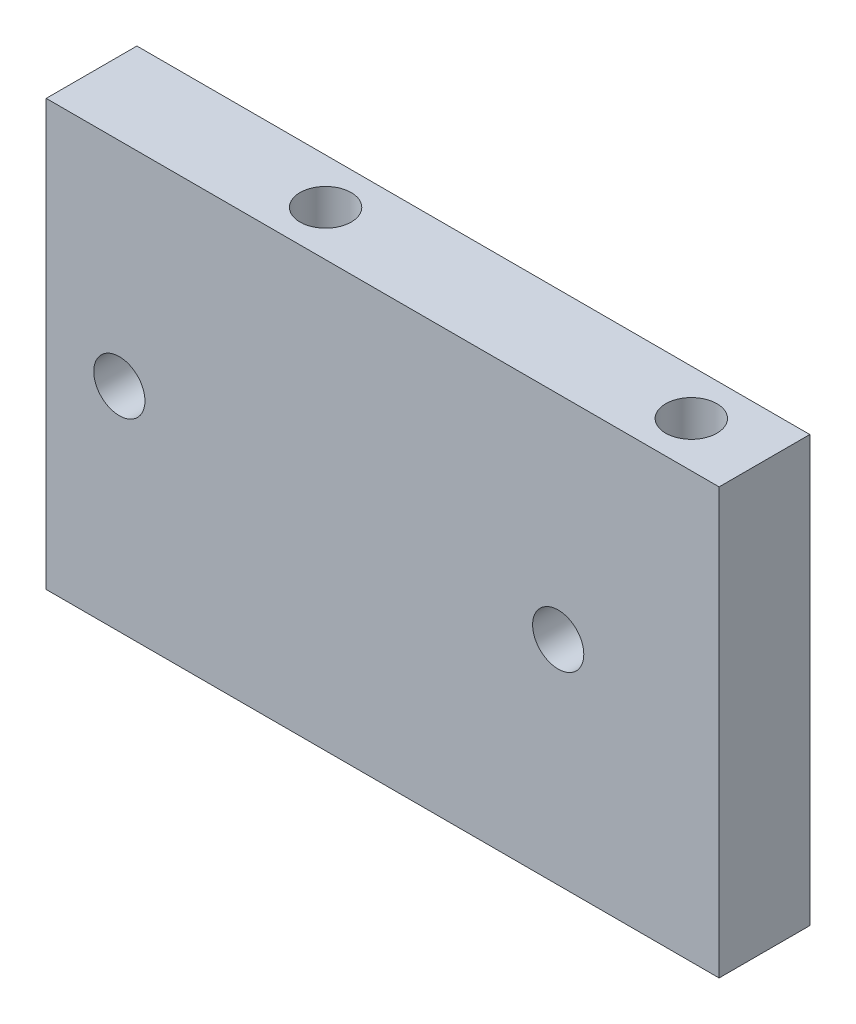
ISO-10303-21;
HEADER;
FILE_DESCRIPTION(('STEP AP214'),'2;1');
FILE_NAME('part.step','',(''),(''),'','','');
FILE_SCHEMA(('AUTOMOTIVE_DESIGN { 1 0 10303 214 1 1 1 1 }'));
ENDSEC;
DATA;
#1=APPLICATION_CONTEXT('core data for automotive mechanical design processes');
#2=APPLICATION_PROTOCOL_DEFINITION('international standard','automotive_design',2000,#1);
#3=PRODUCT_CONTEXT('',#1,'mechanical');
#4=PRODUCT('Part','Part','',(#3));
#5=PRODUCT_RELATED_PRODUCT_CATEGORY('part','',(#4));
#6=PRODUCT_DEFINITION_FORMATION('','',#4);
#7=PRODUCT_DEFINITION_CONTEXT('part definition',#1,'design');
#8=PRODUCT_DEFINITION('design','',#6,#7);
#9=PRODUCT_DEFINITION_SHAPE('','',#8);
#10=(LENGTH_UNIT() NAMED_UNIT(*) SI_UNIT(.MILLI.,.METRE.));
#11=(NAMED_UNIT(*) PLANE_ANGLE_UNIT() SI_UNIT($,.RADIAN.));
#12=(NAMED_UNIT(*) SI_UNIT($,.STERADIAN.) SOLID_ANGLE_UNIT());
#13=UNCERTAINTY_MEASURE_WITH_UNIT(LENGTH_MEASURE(1.E-05),#10,'distance_accuracy_value','');
#14=(GEOMETRIC_REPRESENTATION_CONTEXT(3) GLOBAL_UNCERTAINTY_ASSIGNED_CONTEXT((#13)) GLOBAL_UNIT_ASSIGNED_CONTEXT((#10,
#11,#12)) REPRESENTATION_CONTEXT('',''));
#15=CARTESIAN_POINT('',(0.,0.,0.));
#16=DIRECTION('',(0.,0.,1.));
#17=DIRECTION('',(1.,0.,0.));
#18=AXIS2_PLACEMENT_3D('',#15,#16,#17);
#19=CARTESIAN_POINT('',(23.,14.5375,6.2));
#20=DIRECTION('',(-1.,0.,0.));
#21=DIRECTION('',(0.,0.,1.));
#22=AXIS2_PLACEMENT_3D('',#19,#20,#21);
#23=PLANE('',#22);
#24=DIRECTION('',(0.,1.,0.));
#25=VECTOR('',#24,1.);
#26=CARTESIAN_POINT('',(23.,14.5375,0.));
#27=LINE('',#26,#25);
#28=CARTESIAN_POINT('',(23.,-14.5375,0.));
#29=VERTEX_POINT('',#28);
#30=CARTESIAN_POINT('',(23.,14.5375,0.));
#31=VERTEX_POINT('',#30);
#32=EDGE_CURVE('E102',#29,#31,#27,.T.);
#33=ORIENTED_EDGE('',*,*,#32,.T.);
#34=DIRECTION('',(0.,0.,-1.));
#35=VECTOR('',#34,1.);
#36=CARTESIAN_POINT('',(23.,14.5375,6.2));
#37=LINE('',#36,#35);
#38=CARTESIAN_POINT('',(23.,14.5375,6.2));
#39=VERTEX_POINT('',#38);
#40=EDGE_CURVE('E12',#39,#31,#37,.T.);
#41=ORIENTED_EDGE('',*,*,#40,.F.);
#42=DIRECTION('',(0.,1.,0.));
#43=VECTOR('',#42,1.);
#44=CARTESIAN_POINT('',(23.,14.5375,6.2));
#45=LINE('',#44,#43);
#46=CARTESIAN_POINT('',(23.,-14.5375,6.2));
#47=VERTEX_POINT('',#46);
#48=EDGE_CURVE('E90',#47,#39,#45,.T.);
#49=ORIENTED_EDGE('',*,*,#48,.F.);
#50=DIRECTION('',(0.,0.,-1.));
#51=VECTOR('',#50,1.);
#52=CARTESIAN_POINT('',(23.,-14.5375,6.2));
#53=LINE('',#52,#51);
#54=EDGE_CURVE('E98',#47,#29,#53,.T.);
#55=ORIENTED_EDGE('',*,*,#54,.T.);
#56=EDGE_LOOP('',(#33,#41,#49,#55));
#57=FACE_BOUND('',#56,.T.);
#58=ADVANCED_FACE('F39',(#57),#23,.F.);
#59=CARTESIAN_POINT('',(-23.,14.5375,6.2));
#60=DIRECTION('',(0.,-1.,0.));
#61=DIRECTION('',(0.,0.,-1.));
#62=AXIS2_PLACEMENT_3D('',#59,#60,#61);
#63=PLANE('',#62);
#64=CARTESIAN_POINT('',(18.,14.5375,3.1));
#65=DIRECTION('',(0.,1.,0.));
#66=DIRECTION('',(0.,0.,1.));
#67=AXIS2_PLACEMENT_3D('',#64,#65,#66);
#68=CIRCLE('',#67,1.75);
#69=CARTESIAN_POINT('',(18.,14.5375,4.85));
#70=VERTEX_POINT('',#69);
#71=EDGE_CURVE('E155',#70,#70,#68,.T.);
#72=ORIENTED_EDGE('',*,*,#71,.F.);
#73=EDGE_LOOP('',(#72));
#74=FACE_BOUND('',#73,.T.);
#75=CARTESIAN_POINT('',(-7.,14.5375,3.1));
#76=DIRECTION('',(0.,1.,0.));
#77=DIRECTION('',(0.,0.,1.));
#78=AXIS2_PLACEMENT_3D('',#75,#76,#77);
#79=CIRCLE('',#78,1.75);
#80=CARTESIAN_POINT('',(-7.,14.5375,4.85));
#81=VERTEX_POINT('',#80);
#82=EDGE_CURVE('E149',#81,#81,#79,.T.);
#83=ORIENTED_EDGE('',*,*,#82,.F.);
#84=EDGE_LOOP('',(#83));
#85=FACE_BOUND('',#84,.T.);
#86=DIRECTION('',(-1.,0.,0.));
#87=VECTOR('',#86,1.);
#88=CARTESIAN_POINT('',(-23.,14.5375,0.));
#89=LINE('',#88,#87);
#90=CARTESIAN_POINT('',(-23.,14.5375,0.));
#91=VERTEX_POINT('',#90);
#92=EDGE_CURVE('E94',#31,#91,#89,.T.);
#93=ORIENTED_EDGE('',*,*,#92,.T.);
#94=DIRECTION('',(0.,0.,-1.));
#95=VECTOR('',#94,1.);
#96=CARTESIAN_POINT('',(-23.,14.5375,6.2));
#97=LINE('',#96,#95);
#98=CARTESIAN_POINT('',(-23.,14.5375,6.2));
#99=VERTEX_POINT('',#98);
#100=EDGE_CURVE('E47',#99,#91,#97,.T.);
#101=ORIENTED_EDGE('',*,*,#100,.F.);
#102=DIRECTION('',(-1.,0.,0.));
#103=VECTOR('',#102,1.);
#104=CARTESIAN_POINT('',(-23.,14.5375,6.2));
#105=LINE('',#104,#103);
#106=EDGE_CURVE('E85',#39,#99,#105,.T.);
#107=ORIENTED_EDGE('',*,*,#106,.F.);
#108=ORIENTED_EDGE('',*,*,#40,.T.);
#109=EDGE_LOOP('',(#93,#101,#107,#108));
#110=FACE_BOUND('',#109,.T.);
#111=ADVANCED_FACE('F93',(#74,#85,#110),#63,.F.);
#112=CARTESIAN_POINT('',(-23.,14.5375,6.2));
#113=DIRECTION('',(1.,0.,0.));
#114=DIRECTION('',(0.,0.,-1.));
#115=AXIS2_PLACEMENT_3D('',#112,#113,#114);
#116=PLANE('',#115);
#117=DIRECTION('',(0.,-1.,0.));
#118=VECTOR('',#117,1.);
#119=CARTESIAN_POINT('',(-23.,14.5375,0.));
#120=LINE('',#119,#118);
#121=CARTESIAN_POINT('',(-23.,-14.5375,0.));
#122=VERTEX_POINT('',#121);
#123=EDGE_CURVE('E72',#91,#122,#120,.T.);
#124=ORIENTED_EDGE('',*,*,#123,.T.);
#125=DIRECTION('',(0.,0.,-1.));
#126=VECTOR('',#125,1.);
#127=CARTESIAN_POINT('',(-23.,-14.5375,6.2));
#128=LINE('',#127,#126);
#129=CARTESIAN_POINT('',(-23.,-14.5375,6.2));
#130=VERTEX_POINT('',#129);
#131=EDGE_CURVE('E95',#130,#122,#128,.T.);
#132=ORIENTED_EDGE('',*,*,#131,.F.);
#133=DIRECTION('',(0.,-1.,0.));
#134=VECTOR('',#133,1.);
#135=CARTESIAN_POINT('',(-23.,14.5375,6.2));
#136=LINE('',#135,#134);
#137=EDGE_CURVE('E88',#99,#130,#136,.T.);
#138=ORIENTED_EDGE('',*,*,#137,.F.);
#139=ORIENTED_EDGE('',*,*,#100,.T.);
#140=EDGE_LOOP('',(#124,#132,#138,#139));
#141=FACE_BOUND('',#140,.T.);
#142=ADVANCED_FACE('F96',(#141),#116,.F.);
#143=CARTESIAN_POINT('',(-23.,-14.5375,6.2));
#144=DIRECTION('',(0.,1.,0.));
#145=DIRECTION('',(0.,0.,1.));
#146=AXIS2_PLACEMENT_3D('',#143,#144,#145);
#147=PLANE('',#146);
#148=CARTESIAN_POINT('',(-7.,-14.5375,3.1));
#149=DIRECTION('',(0.,-1.,0.));
#150=DIRECTION('',(0.,0.,-1.));
#151=AXIS2_PLACEMENT_3D('',#148,#149,#150);
#152=CIRCLE('',#151,1.75);
#153=CARTESIAN_POINT('',(-7.,-14.5375,1.35));
#154=VERTEX_POINT('',#153);
#155=EDGE_CURVE('E144',#154,#154,#152,.T.);
#156=ORIENTED_EDGE('',*,*,#155,.F.);
#157=EDGE_LOOP('',(#156));
#158=FACE_BOUND('',#157,.T.);
#159=CARTESIAN_POINT('',(18.,-14.5375,3.1));
#160=DIRECTION('',(0.,-1.,0.));
#161=DIRECTION('',(0.,0.,-1.));
#162=AXIS2_PLACEMENT_3D('',#159,#160,#161);
#163=CIRCLE('',#162,1.75);
#164=CARTESIAN_POINT('',(18.,-14.5375,1.35));
#165=VERTEX_POINT('',#164);
#166=EDGE_CURVE('E137',#165,#165,#163,.T.);
#167=ORIENTED_EDGE('',*,*,#166,.F.);
#168=EDGE_LOOP('',(#167));
#169=FACE_BOUND('',#168,.T.);
#170=DIRECTION('',(1.,0.,0.));
#171=VECTOR('',#170,1.);
#172=CARTESIAN_POINT('',(-23.,-14.5375,0.));
#173=LINE('',#172,#171);
#174=EDGE_CURVE('E78',#122,#29,#173,.T.);
#175=ORIENTED_EDGE('',*,*,#174,.T.);
#176=ORIENTED_EDGE('',*,*,#54,.F.);
#177=DIRECTION('',(1.,0.,0.));
#178=VECTOR('',#177,1.);
#179=CARTESIAN_POINT('',(-23.,-14.5375,6.2));
#180=LINE('',#179,#178);
#181=EDGE_CURVE('E55',#130,#47,#180,.T.);
#182=ORIENTED_EDGE('',*,*,#181,.F.);
#183=ORIENTED_EDGE('',*,*,#131,.T.);
#184=EDGE_LOOP('',(#175,#176,#182,#183));
#185=FACE_BOUND('',#184,.T.);
#186=ADVANCED_FACE('F118',(#158,#169,#185),#147,.F.);
#187=CARTESIAN_POINT('',(0.,0.,6.2));
#188=DIRECTION('',(0.,0.,1.));
#189=DIRECTION('',(1.,0.,0.));
#190=AXIS2_PLACEMENT_3D('',#187,#188,#189);
#191=PLANE('',#190);
#192=CARTESIAN_POINT('',(-18.,0.,6.2));
#193=DIRECTION('',(0.,0.,1.));
#194=DIRECTION('',(1.,0.,0.));
#195=AXIS2_PLACEMENT_3D('',#192,#193,#194);
#196=CIRCLE('',#195,1.75);
#197=CARTESIAN_POINT('',(-16.25,0.,6.2));
#198=VERTEX_POINT('',#197);
#199=EDGE_CURVE('E105',#198,#198,#196,.T.);
#200=ORIENTED_EDGE('',*,*,#199,.F.);
#201=EDGE_LOOP('',(#200));
#202=FACE_BOUND('',#201,.T.);
#203=CARTESIAN_POINT('',(12.,0.,6.2));
#204=DIRECTION('',(0.,0.,1.));
#205=DIRECTION('',(1.,0.,0.));
#206=AXIS2_PLACEMENT_3D('',#203,#204,#205);
#207=CIRCLE('',#206,1.75);
#208=CARTESIAN_POINT('',(13.75,0.,6.2));
#209=VERTEX_POINT('',#208);
#210=EDGE_CURVE('E124',#209,#209,#207,.T.);
#211=ORIENTED_EDGE('',*,*,#210,.F.);
#212=EDGE_LOOP('',(#211));
#213=FACE_BOUND('',#212,.T.);
#214=ORIENTED_EDGE('',*,*,#48,.T.);
#215=ORIENTED_EDGE('',*,*,#106,.T.);
#216=ORIENTED_EDGE('',*,*,#137,.T.);
#217=ORIENTED_EDGE('',*,*,#181,.T.);
#218=EDGE_LOOP('',(#214,#215,#216,#217));
#219=FACE_BOUND('',#218,.T.);
#220=ADVANCED_FACE('F86',(#202,#213,#219),#191,.T.);
#221=CARTESIAN_POINT('',(0.,0.,0.));
#222=DIRECTION('',(0.,0.,1.));
#223=DIRECTION('',(1.,0.,0.));
#224=AXIS2_PLACEMENT_3D('',#221,#222,#223);
#225=PLANE('',#224);
#226=CARTESIAN_POINT('',(-18.,0.,0.));
#227=DIRECTION('',(0.,0.,1.));
#228=DIRECTION('',(1.,0.,0.));
#229=AXIS2_PLACEMENT_3D('',#226,#227,#228);
#230=CIRCLE('',#229,1.75);
#231=CARTESIAN_POINT('',(-16.25,0.,0.));
#232=VERTEX_POINT('',#231);
#233=EDGE_CURVE('E126',#232,#232,#230,.T.);
#234=ORIENTED_EDGE('',*,*,#233,.T.);
#235=EDGE_LOOP('',(#234));
#236=FACE_BOUND('',#235,.T.);
#237=CARTESIAN_POINT('',(12.,0.,0.));
#238=DIRECTION('',(0.,0.,1.));
#239=DIRECTION('',(1.,0.,0.));
#240=AXIS2_PLACEMENT_3D('',#237,#238,#239);
#241=CIRCLE('',#240,1.75);
#242=CARTESIAN_POINT('',(13.75,0.,0.));
#243=VERTEX_POINT('',#242);
#244=EDGE_CURVE('E127',#243,#243,#241,.T.);
#245=ORIENTED_EDGE('',*,*,#244,.T.);
#246=EDGE_LOOP('',(#245));
#247=FACE_BOUND('',#246,.T.);
#248=ORIENTED_EDGE('',*,*,#32,.F.);
#249=ORIENTED_EDGE('',*,*,#174,.F.);
#250=ORIENTED_EDGE('',*,*,#123,.F.);
#251=ORIENTED_EDGE('',*,*,#92,.F.);
#252=EDGE_LOOP('',(#248,#249,#250,#251));
#253=FACE_BOUND('',#252,.T.);
#254=ADVANCED_FACE('F121',(#236,#247,#253),#225,.F.);
#255=CARTESIAN_POINT('',(12.,0.,11.1497474683058));
#256=DIRECTION('',(0.,0.,-1.));
#257=DIRECTION('',(-1.,0.,0.));
#258=AXIS2_PLACEMENT_3D('',#255,#256,#257);
#259=CYLINDRICAL_SURFACE('',#258,1.75);
#260=ORIENTED_EDGE('',*,*,#244,.F.);
#261=EDGE_LOOP('',(#260));
#262=FACE_BOUND('',#261,.T.);
#263=ORIENTED_EDGE('',*,*,#210,.T.);
#264=EDGE_LOOP('',(#263));
#265=FACE_BOUND('',#264,.T.);
#266=ADVANCED_FACE('F225',(#262,#265),#259,.F.);
#267=CARTESIAN_POINT('',(-18.,0.,11.1497474683058));
#268=DIRECTION('',(0.,0.,-1.));
#269=DIRECTION('',(-1.,0.,0.));
#270=AXIS2_PLACEMENT_3D('',#267,#268,#269);
#271=CYLINDRICAL_SURFACE('',#270,1.75);
#272=ORIENTED_EDGE('',*,*,#233,.F.);
#273=EDGE_LOOP('',(#272));
#274=FACE_BOUND('',#273,.T.);
#275=ORIENTED_EDGE('',*,*,#199,.T.);
#276=EDGE_LOOP('',(#275));
#277=FACE_BOUND('',#276,.T.);
#278=ADVANCED_FACE('F233',(#274,#277),#271,.F.);
#279=CARTESIAN_POINT('',(18.,-6.5375,3.1));
#280=DIRECTION('',(0.,-1.,0.));
#281=DIRECTION('',(0.,0.,-1.));
#282=AXIS2_PLACEMENT_3D('',#279,#280,#281);
#283=CYLINDRICAL_SURFACE('',#282,1.75);
#284=CARTESIAN_POINT('',(18.,-6.5375,3.1));
#285=DIRECTION('',(0.,-1.,0.));
#286=DIRECTION('',(0.,0.,-1.));
#287=AXIS2_PLACEMENT_3D('',#284,#285,#286);
#288=CIRCLE('',#287,1.75);
#289=CARTESIAN_POINT('',(18.,-6.5375,1.35));
#290=VERTEX_POINT('',#289);
#291=EDGE_CURVE('E140',#290,#290,#288,.T.);
#292=ORIENTED_EDGE('',*,*,#291,.F.);
#293=EDGE_LOOP('',(#292));
#294=FACE_BOUND('',#293,.T.);
#295=ORIENTED_EDGE('',*,*,#166,.T.);
#296=EDGE_LOOP('',(#295));
#297=FACE_BOUND('',#296,.T.);
#298=ADVANCED_FACE('F240',(#294,#297),#283,.F.);
#299=CARTESIAN_POINT('',(18.,-6.5375,3.1));
#300=DIRECTION('',(0.,-1.,0.));
#301=DIRECTION('',(0.,0.,-1.));
#302=AXIS2_PLACEMENT_3D('',#299,#300,#301);
#303=PLANE('',#302);
#304=ORIENTED_EDGE('',*,*,#291,.T.);
#305=EDGE_LOOP('',(#304));
#306=FACE_BOUND('',#305,.T.);
#307=ADVANCED_FACE('F247',(#306),#303,.T.);
#308=CARTESIAN_POINT('',(-7.,-6.5375,3.1));
#309=DIRECTION('',(0.,-1.,0.));
#310=DIRECTION('',(0.,0.,-1.));
#311=AXIS2_PLACEMENT_3D('',#308,#309,#310);
#312=CYLINDRICAL_SURFACE('',#311,1.75);
#313=CARTESIAN_POINT('',(-7.,-6.5375,3.1));
#314=DIRECTION('',(0.,-1.,0.));
#315=DIRECTION('',(0.,0.,-1.));
#316=AXIS2_PLACEMENT_3D('',#313,#314,#315);
#317=CIRCLE('',#316,1.75);
#318=CARTESIAN_POINT('',(-7.,-6.5375,1.35));
#319=VERTEX_POINT('',#318);
#320=EDGE_CURVE('E131',#319,#319,#317,.T.);
#321=ORIENTED_EDGE('',*,*,#320,.F.);
#322=EDGE_LOOP('',(#321));
#323=FACE_BOUND('',#322,.T.);
#324=ORIENTED_EDGE('',*,*,#155,.T.);
#325=EDGE_LOOP('',(#324));
#326=FACE_BOUND('',#325,.T.);
#327=ADVANCED_FACE('F185',(#323,#326),#312,.F.);
#328=CARTESIAN_POINT('',(-7.,-6.5375,3.1));
#329=DIRECTION('',(0.,-1.,0.));
#330=DIRECTION('',(0.,0.,-1.));
#331=AXIS2_PLACEMENT_3D('',#328,#329,#330);
#332=PLANE('',#331);
#333=ORIENTED_EDGE('',*,*,#320,.T.);
#334=EDGE_LOOP('',(#333));
#335=FACE_BOUND('',#334,.T.);
#336=ADVANCED_FACE('F176',(#335),#332,.T.);
#337=CARTESIAN_POINT('',(-7.,6.5375,3.1));
#338=DIRECTION('',(0.,1.,0.));
#339=DIRECTION('',(0.,0.,1.));
#340=AXIS2_PLACEMENT_3D('',#337,#338,#339);
#341=CYLINDRICAL_SURFACE('',#340,1.75);
#342=CARTESIAN_POINT('',(-7.,6.5375,3.1));
#343=DIRECTION('',(0.,1.,0.));
#344=DIRECTION('',(0.,0.,1.));
#345=AXIS2_PLACEMENT_3D('',#342,#343,#344);
#346=CIRCLE('',#345,1.75);
#347=CARTESIAN_POINT('',(-7.,6.5375,4.85));
#348=VERTEX_POINT('',#347);
#349=EDGE_CURVE('E152',#348,#348,#346,.T.);
#350=ORIENTED_EDGE('',*,*,#349,.F.);
#351=EDGE_LOOP('',(#350));
#352=FACE_BOUND('',#351,.T.);
#353=ORIENTED_EDGE('',*,*,#82,.T.);
#354=EDGE_LOOP('',(#353));
#355=FACE_BOUND('',#354,.T.);
#356=ADVANCED_FACE('F174',(#352,#355),#341,.F.);
#357=CARTESIAN_POINT('',(-7.,6.5375,3.1));
#358=DIRECTION('',(0.,1.,0.));
#359=DIRECTION('',(0.,0.,1.));
#360=AXIS2_PLACEMENT_3D('',#357,#358,#359);
#361=PLANE('',#360);
#362=ORIENTED_EDGE('',*,*,#349,.T.);
#363=EDGE_LOOP('',(#362));
#364=FACE_BOUND('',#363,.T.);
#365=ADVANCED_FACE('F166',(#364),#361,.T.);
#366=CARTESIAN_POINT('',(18.,6.5375,3.1));
#367=DIRECTION('',(0.,1.,0.));
#368=DIRECTION('',(0.,0.,1.));
#369=AXIS2_PLACEMENT_3D('',#366,#367,#368);
#370=CYLINDRICAL_SURFACE('',#369,1.75);
#371=CARTESIAN_POINT('',(18.,6.5375,3.1));
#372=DIRECTION('',(0.,1.,0.));
#373=DIRECTION('',(0.,0.,1.));
#374=AXIS2_PLACEMENT_3D('',#371,#372,#373);
#375=CIRCLE('',#374,1.75);
#376=CARTESIAN_POINT('',(18.,6.5375,4.85));
#377=VERTEX_POINT('',#376);
#378=EDGE_CURVE('E141',#377,#377,#375,.T.);
#379=ORIENTED_EDGE('',*,*,#378,.F.);
#380=EDGE_LOOP('',(#379));
#381=FACE_BOUND('',#380,.T.);
#382=ORIENTED_EDGE('',*,*,#71,.T.);
#383=EDGE_LOOP('',(#382));
#384=FACE_BOUND('',#383,.T.);
#385=ADVANCED_FACE('F163',(#381,#384),#370,.F.);
#386=CARTESIAN_POINT('',(18.,6.5375,3.1));
#387=DIRECTION('',(0.,1.,0.));
#388=DIRECTION('',(0.,0.,1.));
#389=AXIS2_PLACEMENT_3D('',#386,#387,#388);
#390=PLANE('',#389);
#391=ORIENTED_EDGE('',*,*,#378,.T.);
#392=EDGE_LOOP('',(#391));
#393=FACE_BOUND('',#392,.T.);
#394=ADVANCED_FACE('F161',(#393),#390,.T.);
#395=CLOSED_SHELL('',(#58,#111,#142,#186,#220,#254,#266,#278,#298,#307,#327,#336,#356,#365,#385,#394));
#396=MANIFOLD_SOLID_BREP('B2',#395);
#397=ADVANCED_BREP_SHAPE_REPRESENTATION('',(#18,#396),#14);
#398=SHAPE_DEFINITION_REPRESENTATION(#9,#397);
ENDSEC;
END-ISO-10303-21;
